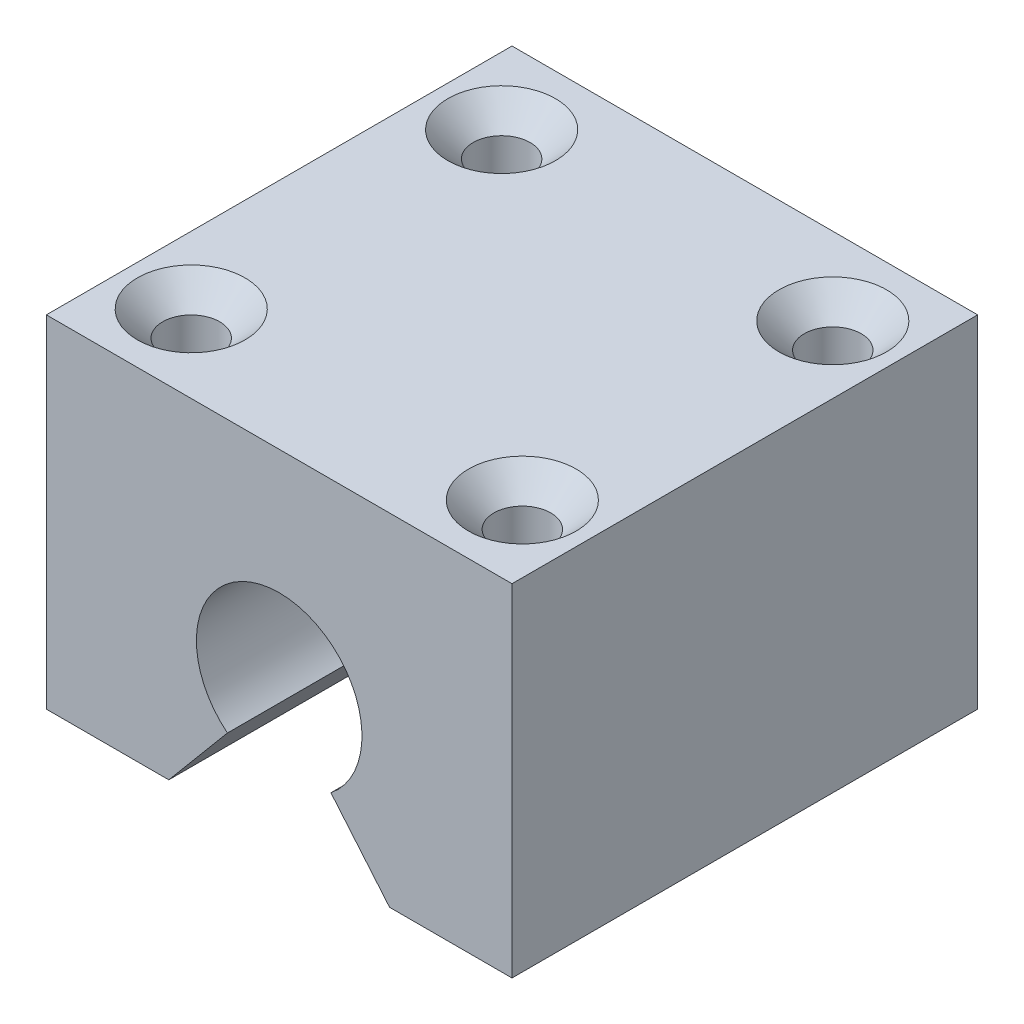
ISO-10303-21;
HEADER;
FILE_DESCRIPTION(('STEP AP214'),'2;1');
FILE_NAME('part.step','',(''),(''),'','','');
FILE_SCHEMA(('AUTOMOTIVE_DESIGN { 1 0 10303 214 1 1 1 1 }'));
ENDSEC;
DATA;
#1=APPLICATION_CONTEXT('core data for automotive mechanical design processes');
#2=APPLICATION_PROTOCOL_DEFINITION('international standard','automotive_design',2000,#1);
#3=PRODUCT_CONTEXT('',#1,'mechanical');
#4=PRODUCT('Part','Part','',(#3));
#5=PRODUCT_RELATED_PRODUCT_CATEGORY('part','',(#4));
#6=PRODUCT_DEFINITION_FORMATION('','',#4);
#7=PRODUCT_DEFINITION_CONTEXT('part definition',#1,'design');
#8=PRODUCT_DEFINITION('design','',#6,#7);
#9=PRODUCT_DEFINITION_SHAPE('','',#8);
#10=(LENGTH_UNIT() NAMED_UNIT(*) SI_UNIT(.MILLI.,.METRE.));
#11=(NAMED_UNIT(*) PLANE_ANGLE_UNIT() SI_UNIT($,.RADIAN.));
#12=(NAMED_UNIT(*) SI_UNIT($,.STERADIAN.) SOLID_ANGLE_UNIT());
#13=UNCERTAINTY_MEASURE_WITH_UNIT(LENGTH_MEASURE(1.E-05),#10,'distance_accuracy_value','');
#14=(GEOMETRIC_REPRESENTATION_CONTEXT(3) GLOBAL_UNCERTAINTY_ASSIGNED_CONTEXT((#13)) GLOBAL_UNIT_ASSIGNED_CONTEXT((#10,
#11,#12)) REPRESENTATION_CONTEXT('',''));
#15=CARTESIAN_POINT('',(0.,0.,0.));
#16=DIRECTION('',(0.,0.,1.));
#17=DIRECTION('',(1.,0.,0.));
#18=AXIS2_PLACEMENT_3D('',#15,#16,#17);
#19=CARTESIAN_POINT('',(-22.5,-16.5,45.));
#20=DIRECTION('',(0.,1.,0.));
#21=DIRECTION('',(0.,0.,1.));
#22=AXIS2_PLACEMENT_3D('',#19,#20,#21);
#23=PLANE('',#22);
#24=DIRECTION('',(1.,0.,0.));
#25=VECTOR('',#24,1.);
#26=CARTESIAN_POINT('',(-22.5,-16.5,45.));
#27=LINE('',#26,#25);
#28=CARTESIAN_POINT('',(10.6681196881457,-16.5,45.));
#29=VERTEX_POINT('',#28);
#30=CARTESIAN_POINT('',(22.5,-16.5,45.));
#31=VERTEX_POINT('',#30);
#32=EDGE_CURVE('E57',#29,#31,#27,.T.);
#33=ORIENTED_EDGE('',*,*,#32,.F.);
#34=DIRECTION('',(0.,0.,1.));
#35=VECTOR('',#34,1.);
#36=CARTESIAN_POINT('',(10.6681196881457,-16.5,0.));
#37=LINE('',#36,#35);
#38=CARTESIAN_POINT('',(10.6681196881457,-16.5,0.));
#39=VERTEX_POINT('',#38);
#40=EDGE_CURVE('E183',#39,#29,#37,.T.);
#41=ORIENTED_EDGE('',*,*,#40,.F.);
#42=DIRECTION('',(1.,0.,0.));
#43=VECTOR('',#42,1.);
#44=CARTESIAN_POINT('',(-22.5,-16.5,0.));
#45=LINE('',#44,#43);
#46=CARTESIAN_POINT('',(22.5,-16.5,0.));
#47=VERTEX_POINT('',#46);
#48=EDGE_CURVE('E79',#39,#47,#45,.T.);
#49=ORIENTED_EDGE('',*,*,#48,.T.);
#50=DIRECTION('',(0.,0.,-1.));
#51=VECTOR('',#50,1.);
#52=CARTESIAN_POINT('',(22.5,-16.5,45.));
#53=LINE('',#52,#51);
#54=EDGE_CURVE('E196',#31,#47,#53,.T.);
#55=ORIENTED_EDGE('',*,*,#54,.F.);
#56=EDGE_LOOP('',(#33,#41,#49,#55));
#57=FACE_BOUND('',#56,.T.);
#58=ADVANCED_FACE('F33',(#57),#23,.F.);
#59=CARTESIAN_POINT('',(22.5,16.5,45.));
#60=DIRECTION('',(-1.,0.,0.));
#61=DIRECTION('',(0.,-1.,0.));
#62=AXIS2_PLACEMENT_3D('',#59,#60,#61);
#63=PLANE('',#62);
#64=DIRECTION('',(0.,1.,0.));
#65=VECTOR('',#64,1.);
#66=CARTESIAN_POINT('',(22.5,16.5,0.));
#67=LINE('',#66,#65);
#68=CARTESIAN_POINT('',(22.5,16.5,0.));
#69=VERTEX_POINT('',#68);
#70=EDGE_CURVE('E182',#47,#69,#67,.T.);
#71=ORIENTED_EDGE('',*,*,#70,.T.);
#72=DIRECTION('',(0.,0.,-1.));
#73=VECTOR('',#72,1.);
#74=CARTESIAN_POINT('',(22.5,16.5,45.));
#75=LINE('',#74,#73);
#76=CARTESIAN_POINT('',(22.5,16.5,45.));
#77=VERTEX_POINT('',#76);
#78=EDGE_CURVE('E11',#77,#69,#75,.T.);
#79=ORIENTED_EDGE('',*,*,#78,.F.);
#80=DIRECTION('',(0.,1.,0.));
#81=VECTOR('',#80,1.);
#82=CARTESIAN_POINT('',(22.5,16.5,45.));
#83=LINE('',#82,#81);
#84=EDGE_CURVE('E187',#31,#77,#83,.T.);
#85=ORIENTED_EDGE('',*,*,#84,.F.);
#86=ORIENTED_EDGE('',*,*,#54,.T.);
#87=EDGE_LOOP('',(#71,#79,#85,#86));
#88=FACE_BOUND('',#87,.T.);
#89=ADVANCED_FACE('F35',(#88),#63,.F.);
#90=CARTESIAN_POINT('',(-22.5,16.5,45.));
#91=DIRECTION('',(0.,-1.,0.));
#92=DIRECTION('',(0.,0.,-1.));
#93=AXIS2_PLACEMENT_3D('',#90,#91,#92);
#94=PLANE('',#93);
#95=CARTESIAN_POINT('',(-16.,16.5,37.5));
#96=DIRECTION('',(0.,1.,0.));
#97=DIRECTION('',(0.,0.,1.));
#98=AXIS2_PLACEMENT_3D('',#95,#96,#97);
#99=CIRCLE('',#98,5.2);
#100=CARTESIAN_POINT('',(-16.,16.5,42.7));
#101=VERTEX_POINT('',#100);
#102=EDGE_CURVE('E136',#101,#101,#99,.T.);
#103=ORIENTED_EDGE('',*,*,#102,.F.);
#104=EDGE_LOOP('',(#103));
#105=FACE_BOUND('',#104,.T.);
#106=CARTESIAN_POINT('',(-16.,16.5,7.5));
#107=DIRECTION('',(0.,1.,0.));
#108=DIRECTION('',(0.,0.,1.));
#109=AXIS2_PLACEMENT_3D('',#106,#107,#108);
#110=CIRCLE('',#109,5.2);
#111=CARTESIAN_POINT('',(-16.,16.5,12.7));
#112=VERTEX_POINT('',#111);
#113=EDGE_CURVE('E129',#112,#112,#110,.T.);
#114=ORIENTED_EDGE('',*,*,#113,.F.);
#115=EDGE_LOOP('',(#114));
#116=FACE_BOUND('',#115,.T.);
#117=CARTESIAN_POINT('',(16.,16.5,7.5));
#118=DIRECTION('',(0.,1.,0.));
#119=DIRECTION('',(0.,0.,1.));
#120=AXIS2_PLACEMENT_3D('',#117,#118,#119);
#121=CIRCLE('',#120,5.2);
#122=CARTESIAN_POINT('',(16.,16.5,12.7));
#123=VERTEX_POINT('',#122);
#124=EDGE_CURVE('E145',#123,#123,#121,.T.);
#125=ORIENTED_EDGE('',*,*,#124,.F.);
#126=EDGE_LOOP('',(#125));
#127=FACE_BOUND('',#126,.T.);
#128=CARTESIAN_POINT('',(16.,16.5,37.5));
#129=DIRECTION('',(0.,1.,0.));
#130=DIRECTION('',(0.,0.,1.));
#131=AXIS2_PLACEMENT_3D('',#128,#129,#130);
#132=CIRCLE('',#131,5.2);
#133=CARTESIAN_POINT('',(16.,16.5,42.7));
#134=VERTEX_POINT('',#133);
#135=EDGE_CURVE('E154',#134,#134,#132,.T.);
#136=ORIENTED_EDGE('',*,*,#135,.F.);
#137=EDGE_LOOP('',(#136));
#138=FACE_BOUND('',#137,.T.);
#139=DIRECTION('',(-1.,0.,0.));
#140=VECTOR('',#139,1.);
#141=CARTESIAN_POINT('',(-22.5,16.5,0.));
#142=LINE('',#141,#140);
#143=CARTESIAN_POINT('',(-22.5,16.5,0.));
#144=VERTEX_POINT('',#143);
#145=EDGE_CURVE('E199',#69,#144,#142,.T.);
#146=ORIENTED_EDGE('',*,*,#145,.T.);
#147=DIRECTION('',(0.,0.,-1.));
#148=VECTOR('',#147,1.);
#149=CARTESIAN_POINT('',(-22.5,16.5,45.));
#150=LINE('',#149,#148);
#151=CARTESIAN_POINT('',(-22.5,16.5,45.));
#152=VERTEX_POINT('',#151);
#153=EDGE_CURVE('E41',#152,#144,#150,.T.);
#154=ORIENTED_EDGE('',*,*,#153,.F.);
#155=DIRECTION('',(-1.,0.,0.));
#156=VECTOR('',#155,1.);
#157=CARTESIAN_POINT('',(-22.5,16.5,45.));
#158=LINE('',#157,#156);
#159=EDGE_CURVE('E86',#77,#152,#158,.T.);
#160=ORIENTED_EDGE('',*,*,#159,.F.);
#161=ORIENTED_EDGE('',*,*,#78,.T.);
#162=EDGE_LOOP('',(#146,#154,#160,#161));
#163=FACE_BOUND('',#162,.T.);
#164=ADVANCED_FACE('F227',(#105,#116,#127,#138,#163),#94,.F.);
#165=CARTESIAN_POINT('',(-22.5,16.5,45.));
#166=DIRECTION('',(1.,0.,0.));
#167=DIRECTION('',(0.,0.,-1.));
#168=AXIS2_PLACEMENT_3D('',#165,#166,#167);
#169=PLANE('',#168);
#170=DIRECTION('',(0.,-1.,0.));
#171=VECTOR('',#170,1.);
#172=CARTESIAN_POINT('',(-22.5,16.5,0.));
#173=LINE('',#172,#171);
#174=CARTESIAN_POINT('',(-22.5,-16.5,0.));
#175=VERTEX_POINT('',#174);
#176=EDGE_CURVE('E201',#144,#175,#173,.T.);
#177=ORIENTED_EDGE('',*,*,#176,.T.);
#178=DIRECTION('',(0.,0.,-1.));
#179=VECTOR('',#178,1.);
#180=CARTESIAN_POINT('',(-22.5,-16.5,45.));
#181=LINE('',#180,#179);
#182=CARTESIAN_POINT('',(-22.5,-16.5,45.));
#183=VERTEX_POINT('',#182);
#184=EDGE_CURVE('E206',#183,#175,#181,.T.);
#185=ORIENTED_EDGE('',*,*,#184,.F.);
#186=DIRECTION('',(0.,-1.,0.));
#187=VECTOR('',#186,1.);
#188=CARTESIAN_POINT('',(-22.5,16.5,45.));
#189=LINE('',#188,#187);
#190=EDGE_CURVE('E191',#152,#183,#189,.T.);
#191=ORIENTED_EDGE('',*,*,#190,.F.);
#192=ORIENTED_EDGE('',*,*,#153,.T.);
#193=EDGE_LOOP('',(#177,#185,#191,#192));
#194=FACE_BOUND('',#193,.T.);
#195=ADVANCED_FACE('F212',(#194),#169,.F.);
#196=CARTESIAN_POINT('',(-10.6681196881457,-16.5,0.));
#197=VERTEX_POINT('',#196);
#198=EDGE_CURVE('E189',#175,#197,#45,.T.);
#199=ORIENTED_EDGE('',*,*,#198,.T.);
#200=DIRECTION('',(0.,0.,1.));
#201=VECTOR('',#200,1.);
#202=CARTESIAN_POINT('',(-10.6681196881457,-16.5,0.));
#203=LINE('',#202,#201);
#204=CARTESIAN_POINT('',(-10.6681196881457,-16.5,45.));
#205=VERTEX_POINT('',#204);
#206=EDGE_CURVE('E48',#197,#205,#203,.T.);
#207=ORIENTED_EDGE('',*,*,#206,.T.);
#208=EDGE_CURVE('E193',#183,#205,#27,.T.);
#209=ORIENTED_EDGE('',*,*,#208,.F.);
#210=ORIENTED_EDGE('',*,*,#184,.T.);
#211=EDGE_LOOP('',(#199,#207,#209,#210));
#212=FACE_BOUND('',#211,.T.);
#213=ADVANCED_FACE('F219',(#212),#23,.F.);
#214=CARTESIAN_POINT('',(0.,0.,45.));
#215=DIRECTION('',(0.,0.,1.));
#216=DIRECTION('',(1.,0.,0.));
#217=AXIS2_PLACEMENT_3D('',#214,#215,#216);
#218=PLANE('',#217);
#219=DIRECTION('',(-0.642787609686541,0.766044443118977,0.));
#220=VECTOR('',#219,1.);
#221=CARTESIAN_POINT('',(5.,-9.74499799839839,45.));
#222=LINE('',#221,#220);
#223=CARTESIAN_POINT('',(5.,-9.74499799839839,45.));
#224=VERTEX_POINT('',#223);
#225=EDGE_CURVE('E168',#29,#224,#222,.T.);
#226=ORIENTED_EDGE('',*,*,#225,.F.);
#227=ORIENTED_EDGE('',*,*,#32,.T.);
#228=ORIENTED_EDGE('',*,*,#84,.T.);
#229=ORIENTED_EDGE('',*,*,#159,.T.);
#230=ORIENTED_EDGE('',*,*,#190,.T.);
#231=ORIENTED_EDGE('',*,*,#208,.T.);
#232=DIRECTION('',(-0.64278760968654,-0.766044443118977,0.));
#233=VECTOR('',#232,1.);
#234=CARTESIAN_POINT('',(-5.,-9.74499799839839,45.));
#235=LINE('',#234,#233);
#236=CARTESIAN_POINT('',(-5.,-9.74499799839839,45.));
#237=VERTEX_POINT('',#236);
#238=EDGE_CURVE('E176',#237,#205,#235,.T.);
#239=ORIENTED_EDGE('',*,*,#238,.F.);
#240=CARTESIAN_POINT('',(0.,-3.5,45.));
#241=DIRECTION('',(0.,0.,1.));
#242=DIRECTION('',(1.,0.,0.));
#243=AXIS2_PLACEMENT_3D('',#240,#241,#242);
#244=CIRCLE('',#243,8.);
#245=EDGE_CURVE('E163',#224,#237,#244,.T.);
#246=ORIENTED_EDGE('',*,*,#245,.F.);
#247=EDGE_LOOP('',(#226,#227,#228,#229,#230,#231,#239,#246));
#248=FACE_BOUND('',#247,.T.);
#249=ADVANCED_FACE('F222',(#248),#218,.T.);
#250=CARTESIAN_POINT('',(0.,0.,0.));
#251=DIRECTION('',(0.,0.,1.));
#252=DIRECTION('',(1.,0.,0.));
#253=AXIS2_PLACEMENT_3D('',#250,#251,#252);
#254=PLANE('',#253);
#255=ORIENTED_EDGE('',*,*,#48,.F.);
#256=DIRECTION('',(-0.642787609686541,0.766044443118977,0.));
#257=VECTOR('',#256,1.);
#258=CARTESIAN_POINT('',(5.,-9.74499799839839,0.));
#259=LINE('',#258,#257);
#260=CARTESIAN_POINT('',(5.,-9.74499799839839,0.));
#261=VERTEX_POINT('',#260);
#262=EDGE_CURVE('E170',#39,#261,#259,.T.);
#263=ORIENTED_EDGE('',*,*,#262,.T.);
#264=CARTESIAN_POINT('',(0.,-3.5,0.));
#265=DIRECTION('',(0.,0.,1.));
#266=DIRECTION('',(1.,0.,0.));
#267=AXIS2_PLACEMENT_3D('',#264,#265,#266);
#268=CIRCLE('',#267,8.);
#269=CARTESIAN_POINT('',(-5.,-9.74499799839839,0.));
#270=VERTEX_POINT('',#269);
#271=EDGE_CURVE('E164',#261,#270,#268,.T.);
#272=ORIENTED_EDGE('',*,*,#271,.T.);
#273=DIRECTION('',(-0.64278760968654,-0.766044443118977,0.));
#274=VECTOR('',#273,1.);
#275=CARTESIAN_POINT('',(-5.,-9.74499799839839,0.));
#276=LINE('',#275,#274);
#277=EDGE_CURVE('E167',#270,#197,#276,.T.);
#278=ORIENTED_EDGE('',*,*,#277,.T.);
#279=ORIENTED_EDGE('',*,*,#198,.F.);
#280=ORIENTED_EDGE('',*,*,#176,.F.);
#281=ORIENTED_EDGE('',*,*,#145,.F.);
#282=ORIENTED_EDGE('',*,*,#70,.F.);
#283=EDGE_LOOP('',(#255,#263,#272,#278,#279,#280,#281,#282));
#284=FACE_BOUND('',#283,.T.);
#285=ADVANCED_FACE('F216',(#284),#254,.F.);
#286=CARTESIAN_POINT('',(0.,-3.5,0.));
#287=DIRECTION('',(0.,0.,1.));
#288=DIRECTION('',(1.,0.,0.));
#289=AXIS2_PLACEMENT_3D('',#286,#287,#288);
#290=CYLINDRICAL_SURFACE('',#289,8.);
#291=ORIENTED_EDGE('',*,*,#245,.T.);
#292=DIRECTION('',(0.,0.,1.));
#293=VECTOR('',#292,1.);
#294=CARTESIAN_POINT('',(-5.,-9.74499799839839,0.));
#295=LINE('',#294,#293);
#296=EDGE_CURVE('E173',#270,#237,#295,.T.);
#297=ORIENTED_EDGE('',*,*,#296,.F.);
#298=ORIENTED_EDGE('',*,*,#271,.F.);
#299=DIRECTION('',(0.,0.,1.));
#300=VECTOR('',#299,1.);
#301=CARTESIAN_POINT('',(5.,-9.74499799839839,0.));
#302=LINE('',#301,#300);
#303=EDGE_CURVE('E180',#261,#224,#302,.T.);
#304=ORIENTED_EDGE('',*,*,#303,.T.);
#305=EDGE_LOOP('',(#291,#297,#298,#304));
#306=FACE_BOUND('',#305,.T.);
#307=ADVANCED_FACE('F250',(#306),#290,.F.);
#308=CARTESIAN_POINT('',(5.,-9.74499799839839,0.));
#309=DIRECTION('',(0.766044443118977,0.642787609686541,0.));
#310=DIRECTION('',(-0.642787609686541,0.766044443118977,0.));
#311=AXIS2_PLACEMENT_3D('',#308,#309,#310);
#312=PLANE('',#311);
#313=ORIENTED_EDGE('',*,*,#225,.T.);
#314=ORIENTED_EDGE('',*,*,#303,.F.);
#315=ORIENTED_EDGE('',*,*,#262,.F.);
#316=ORIENTED_EDGE('',*,*,#40,.T.);
#317=EDGE_LOOP('',(#313,#314,#315,#316));
#318=FACE_BOUND('',#317,.T.);
#319=ADVANCED_FACE('F254',(#318),#312,.F.);
#320=CARTESIAN_POINT('',(-5.,-9.74499799839839,0.));
#321=DIRECTION('',(-0.766044443118977,0.64278760968654,0.));
#322=DIRECTION('',(-0.64278760968654,-0.766044443118977,0.));
#323=AXIS2_PLACEMENT_3D('',#320,#321,#322);
#324=PLANE('',#323);
#325=ORIENTED_EDGE('',*,*,#238,.T.);
#326=ORIENTED_EDGE('',*,*,#206,.F.);
#327=ORIENTED_EDGE('',*,*,#277,.F.);
#328=ORIENTED_EDGE('',*,*,#296,.T.);
#329=EDGE_LOOP('',(#325,#326,#327,#328));
#330=FACE_BOUND('',#329,.T.);
#331=ADVANCED_FACE('F256',(#330),#324,.F.);
#332=CARTESIAN_POINT('',(16.,4.5,37.5));
#333=DIRECTION('',(0.,1.,0.));
#334=DIRECTION('',(0.,0.,1.));
#335=AXIS2_PLACEMENT_3D('',#332,#333,#334);
#336=CONICAL_SURFACE('',#335,2.75,1.02974425867665);
#337=CARTESIAN_POINT('',(16.,2.84763329767421,37.5));
#338=VERTEX_POINT('',#337);
#339=VERTEX_LOOP('',#338);
#340=FACE_BOUND('',#339,.T.);
#341=CARTESIAN_POINT('',(16.,4.5,37.5));
#342=DIRECTION('',(0.,1.,0.));
#343=DIRECTION('',(0.,0.,1.));
#344=AXIS2_PLACEMENT_3D('',#341,#342,#343);
#345=CIRCLE('',#344,2.75);
#346=CARTESIAN_POINT('',(16.,4.5,40.25));
#347=VERTEX_POINT('',#346);
#348=EDGE_CURVE('E160',#347,#347,#345,.T.);
#349=ORIENTED_EDGE('',*,*,#348,.T.);
#350=EDGE_LOOP('',(#349));
#351=FACE_BOUND('',#350,.T.);
#352=ADVANCED_FACE('F259',(#340,#351),#336,.F.);
#353=CARTESIAN_POINT('',(16.,16.5,37.5));
#354=DIRECTION('',(0.,1.,0.));
#355=DIRECTION('',(0.,0.,1.));
#356=AXIS2_PLACEMENT_3D('',#353,#354,#355);
#357=CYLINDRICAL_SURFACE('',#356,2.75);
#358=ORIENTED_EDGE('',*,*,#348,.F.);
#359=EDGE_LOOP('',(#358));
#360=FACE_BOUND('',#359,.T.);
#361=CARTESIAN_POINT('',(16.,14.05,37.5));
#362=DIRECTION('',(0.,1.,0.));
#363=DIRECTION('',(0.,0.,1.));
#364=AXIS2_PLACEMENT_3D('',#361,#362,#363);
#365=CIRCLE('',#364,2.75);
#366=CARTESIAN_POINT('',(16.,14.05,40.25));
#367=VERTEX_POINT('',#366);
#368=EDGE_CURVE('E157',#367,#367,#365,.T.);
#369=ORIENTED_EDGE('',*,*,#368,.T.);
#370=EDGE_LOOP('',(#369));
#371=FACE_BOUND('',#370,.T.);
#372=ADVANCED_FACE('F265',(#360,#371),#357,.F.);
#373=CARTESIAN_POINT('',(16.,16.5,37.5));
#374=DIRECTION('',(0.,1.,0.));
#375=DIRECTION('',(0.,0.,1.));
#376=AXIS2_PLACEMENT_3D('',#373,#374,#375);
#377=CONICAL_SURFACE('',#376,5.2,0.785398163397448);
#378=ORIENTED_EDGE('',*,*,#368,.F.);
#379=EDGE_LOOP('',(#378));
#380=FACE_BOUND('',#379,.T.);
#381=ORIENTED_EDGE('',*,*,#135,.T.);
#382=EDGE_LOOP('',(#381));
#383=FACE_BOUND('',#382,.T.);
#384=ADVANCED_FACE('F269',(#380,#383),#377,.F.);
#385=CARTESIAN_POINT('',(16.,4.5,7.5));
#386=DIRECTION('',(0.,1.,0.));
#387=DIRECTION('',(0.,0.,1.));
#388=AXIS2_PLACEMENT_3D('',#385,#386,#387);
#389=CONICAL_SURFACE('',#388,2.75,1.02974425867665);
#390=CARTESIAN_POINT('',(16.,2.84763329767421,7.5));
#391=VERTEX_POINT('',#390);
#392=VERTEX_LOOP('',#391);
#393=FACE_BOUND('',#392,.T.);
#394=CARTESIAN_POINT('',(16.,4.5,7.5));
#395=DIRECTION('',(0.,1.,0.));
#396=DIRECTION('',(0.,0.,1.));
#397=AXIS2_PLACEMENT_3D('',#394,#395,#396);
#398=CIRCLE('',#397,2.75);
#399=CARTESIAN_POINT('',(16.,4.5,10.25));
#400=VERTEX_POINT('',#399);
#401=EDGE_CURVE('E151',#400,#400,#398,.T.);
#402=ORIENTED_EDGE('',*,*,#401,.T.);
#403=EDGE_LOOP('',(#402));
#404=FACE_BOUND('',#403,.T.);
#405=ADVANCED_FACE('F273',(#393,#404),#389,.F.);
#406=CARTESIAN_POINT('',(16.,16.5,7.5));
#407=DIRECTION('',(0.,1.,0.));
#408=DIRECTION('',(0.,0.,1.));
#409=AXIS2_PLACEMENT_3D('',#406,#407,#408);
#410=CYLINDRICAL_SURFACE('',#409,2.75);
#411=ORIENTED_EDGE('',*,*,#401,.F.);
#412=EDGE_LOOP('',(#411));
#413=FACE_BOUND('',#412,.T.);
#414=CARTESIAN_POINT('',(16.,14.05,7.5));
#415=DIRECTION('',(0.,1.,0.));
#416=DIRECTION('',(0.,0.,1.));
#417=AXIS2_PLACEMENT_3D('',#414,#415,#416);
#418=CIRCLE('',#417,2.75);
#419=CARTESIAN_POINT('',(16.,14.05,10.25));
#420=VERTEX_POINT('',#419);
#421=EDGE_CURVE('E148',#420,#420,#418,.T.);
#422=ORIENTED_EDGE('',*,*,#421,.T.);
#423=EDGE_LOOP('',(#422));
#424=FACE_BOUND('',#423,.T.);
#425=ADVANCED_FACE('F277',(#413,#424),#410,.F.);
#426=CARTESIAN_POINT('',(16.,16.5,7.5));
#427=DIRECTION('',(0.,1.,0.));
#428=DIRECTION('',(0.,0.,1.));
#429=AXIS2_PLACEMENT_3D('',#426,#427,#428);
#430=CONICAL_SURFACE('',#429,5.2,0.785398163397448);
#431=ORIENTED_EDGE('',*,*,#421,.F.);
#432=EDGE_LOOP('',(#431));
#433=FACE_BOUND('',#432,.T.);
#434=ORIENTED_EDGE('',*,*,#124,.T.);
#435=EDGE_LOOP('',(#434));
#436=FACE_BOUND('',#435,.T.);
#437=ADVANCED_FACE('F281',(#433,#436),#430,.F.);
#438=CARTESIAN_POINT('',(-16.,4.5,7.5));
#439=DIRECTION('',(0.,1.,0.));
#440=DIRECTION('',(0.,0.,1.));
#441=AXIS2_PLACEMENT_3D('',#438,#439,#440);
#442=CONICAL_SURFACE('',#441,2.75,1.02974425867665);
#443=CARTESIAN_POINT('',(-16.,2.84763329767421,7.5));
#444=VERTEX_POINT('',#443);
#445=VERTEX_LOOP('',#444);
#446=FACE_BOUND('',#445,.T.);
#447=CARTESIAN_POINT('',(-16.,4.5,7.5));
#448=DIRECTION('',(0.,1.,0.));
#449=DIRECTION('',(0.,0.,1.));
#450=AXIS2_PLACEMENT_3D('',#447,#448,#449);
#451=CIRCLE('',#450,2.75);
#452=CARTESIAN_POINT('',(-16.,4.5,10.25));
#453=VERTEX_POINT('',#452);
#454=EDGE_CURVE('E142',#453,#453,#451,.T.);
#455=ORIENTED_EDGE('',*,*,#454,.T.);
#456=EDGE_LOOP('',(#455));
#457=FACE_BOUND('',#456,.T.);
#458=ADVANCED_FACE('F285',(#446,#457),#442,.F.);
#459=CARTESIAN_POINT('',(-16.,16.5,7.5));
#460=DIRECTION('',(0.,1.,0.));
#461=DIRECTION('',(0.,0.,1.));
#462=AXIS2_PLACEMENT_3D('',#459,#460,#461);
#463=CYLINDRICAL_SURFACE('',#462,2.75);
#464=ORIENTED_EDGE('',*,*,#454,.F.);
#465=EDGE_LOOP('',(#464));
#466=FACE_BOUND('',#465,.T.);
#467=CARTESIAN_POINT('',(-16.,14.05,7.5));
#468=DIRECTION('',(0.,1.,0.));
#469=DIRECTION('',(0.,0.,1.));
#470=AXIS2_PLACEMENT_3D('',#467,#468,#469);
#471=CIRCLE('',#470,2.75);
#472=CARTESIAN_POINT('',(-16.,14.05,10.25));
#473=VERTEX_POINT('',#472);
#474=EDGE_CURVE('E133',#473,#473,#471,.T.);
#475=ORIENTED_EDGE('',*,*,#474,.T.);
#476=EDGE_LOOP('',(#475));
#477=FACE_BOUND('',#476,.T.);
#478=ADVANCED_FACE('F289',(#466,#477),#463,.F.);
#479=CARTESIAN_POINT('',(-16.,16.5,7.5));
#480=DIRECTION('',(0.,1.,0.));
#481=DIRECTION('',(0.,0.,1.));
#482=AXIS2_PLACEMENT_3D('',#479,#480,#481);
#483=CONICAL_SURFACE('',#482,5.2,0.785398163397449);
#484=ORIENTED_EDGE('',*,*,#474,.F.);
#485=EDGE_LOOP('',(#484));
#486=FACE_BOUND('',#485,.T.);
#487=ORIENTED_EDGE('',*,*,#113,.T.);
#488=EDGE_LOOP('',(#487));
#489=FACE_BOUND('',#488,.T.);
#490=ADVANCED_FACE('F123',(#486,#489),#483,.F.);
#491=CARTESIAN_POINT('',(-16.,4.5,37.5));
#492=DIRECTION('',(0.,1.,0.));
#493=DIRECTION('',(0.,0.,1.));
#494=AXIS2_PLACEMENT_3D('',#491,#492,#493);
#495=CONICAL_SURFACE('',#494,2.75,1.02974425867665);
#496=CARTESIAN_POINT('',(-16.,2.84763329767421,37.5));
#497=VERTEX_POINT('',#496);
#498=VERTEX_LOOP('',#497);
#499=FACE_BOUND('',#498,.T.);
#500=CARTESIAN_POINT('',(-16.,4.5,37.5));
#501=DIRECTION('',(0.,1.,0.));
#502=DIRECTION('',(0.,0.,1.));
#503=AXIS2_PLACEMENT_3D('',#500,#501,#502);
#504=CIRCLE('',#503,2.75);
#505=CARTESIAN_POINT('',(-16.,4.5,40.25));
#506=VERTEX_POINT('',#505);
#507=EDGE_CURVE('E127',#506,#506,#504,.T.);
#508=ORIENTED_EDGE('',*,*,#507,.T.);
#509=EDGE_LOOP('',(#508));
#510=FACE_BOUND('',#509,.T.);
#511=ADVANCED_FACE('F119',(#499,#510),#495,.F.);
#512=CARTESIAN_POINT('',(-16.,16.5,37.5));
#513=DIRECTION('',(0.,1.,0.));
#514=DIRECTION('',(0.,0.,1.));
#515=AXIS2_PLACEMENT_3D('',#512,#513,#514);
#516=CYLINDRICAL_SURFACE('',#515,2.75);
#517=ORIENTED_EDGE('',*,*,#507,.F.);
#518=EDGE_LOOP('',(#517));
#519=FACE_BOUND('',#518,.T.);
#520=CARTESIAN_POINT('',(-16.,14.05,37.5));
#521=DIRECTION('',(0.,1.,0.));
#522=DIRECTION('',(0.,0.,1.));
#523=AXIS2_PLACEMENT_3D('',#520,#521,#522);
#524=CIRCLE('',#523,2.75);
#525=CARTESIAN_POINT('',(-16.,14.05,40.25));
#526=VERTEX_POINT('',#525);
#527=EDGE_CURVE('E130',#526,#526,#524,.T.);
#528=ORIENTED_EDGE('',*,*,#527,.T.);
#529=EDGE_LOOP('',(#528));
#530=FACE_BOUND('',#529,.T.);
#531=ADVANCED_FACE('F122',(#519,#530),#516,.F.);
#532=CARTESIAN_POINT('',(-16.,16.5,37.5));
#533=DIRECTION('',(0.,1.,0.));
#534=DIRECTION('',(0.,0.,1.));
#535=AXIS2_PLACEMENT_3D('',#532,#533,#534);
#536=CONICAL_SURFACE('',#535,5.2,0.785398163397449);
#537=ORIENTED_EDGE('',*,*,#527,.F.);
#538=EDGE_LOOP('',(#537));
#539=FACE_BOUND('',#538,.T.);
#540=ORIENTED_EDGE('',*,*,#102,.T.);
#541=EDGE_LOOP('',(#540));
#542=FACE_BOUND('',#541,.T.);
#543=ADVANCED_FACE('F299',(#539,#542),#536,.F.);
#544=CLOSED_SHELL('',(#58,#89,#164,#195,#213,#249,#285,#307,#319,#331,#352,#372,#384,#405,#425,
#437,#458,#478,#490,#511,#531,#543));
#545=MANIFOLD_SOLID_BREP('B2',#544);
#546=ADVANCED_BREP_SHAPE_REPRESENTATION('',(#18,#545),#14);
#547=SHAPE_DEFINITION_REPRESENTATION(#9,#546);
ENDSEC;
END-ISO-10303-21;
